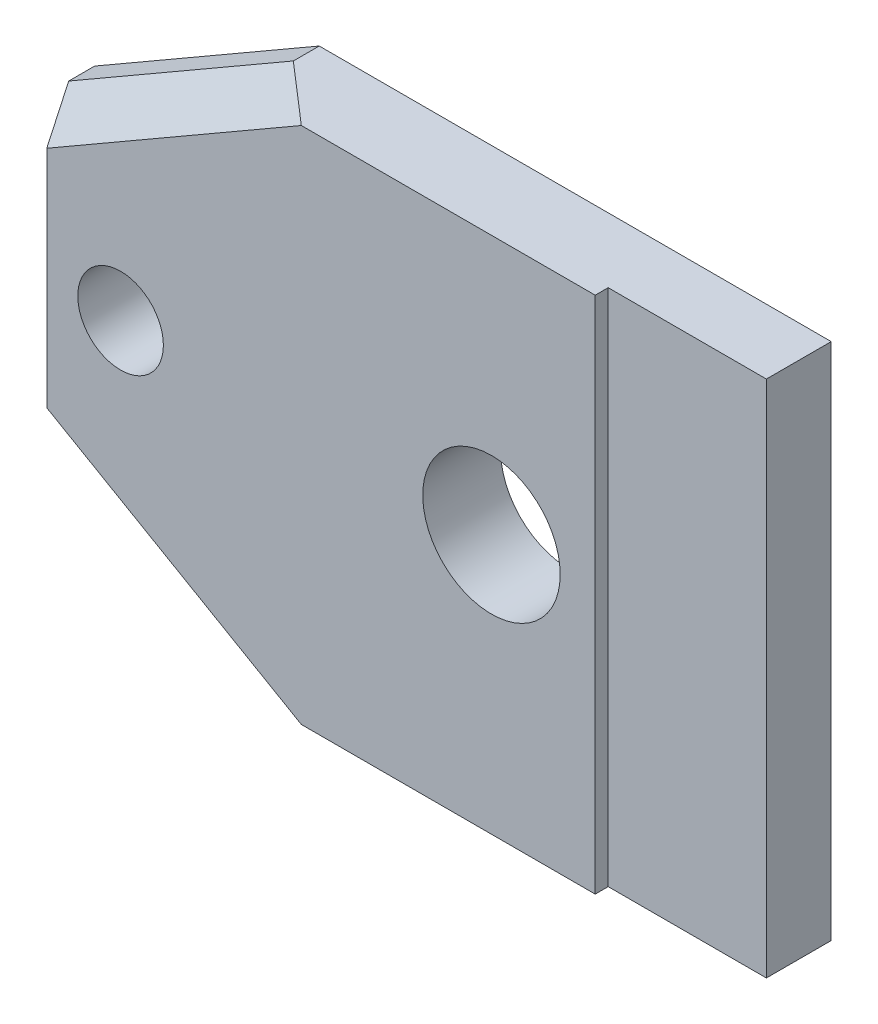
ISO-10303-21;
HEADER;
FILE_DESCRIPTION(('STEP AP214'),'2;1');
FILE_NAME('part.step','',(''),(''),'','','');
FILE_SCHEMA(('AUTOMOTIVE_DESIGN { 1 0 10303 214 1 1 1 1 }'));
ENDSEC;
DATA;
#1=APPLICATION_CONTEXT('core data for automotive mechanical design processes');
#2=APPLICATION_PROTOCOL_DEFINITION('international standard','automotive_design',2000,#1);
#3=PRODUCT_CONTEXT('',#1,'mechanical');
#4=PRODUCT('Part','Part','',(#3));
#5=PRODUCT_RELATED_PRODUCT_CATEGORY('part','',(#4));
#6=PRODUCT_DEFINITION_FORMATION('','',#4);
#7=PRODUCT_DEFINITION_CONTEXT('part definition',#1,'design');
#8=PRODUCT_DEFINITION('design','',#6,#7);
#9=PRODUCT_DEFINITION_SHAPE('','',#8);
#10=(LENGTH_UNIT() NAMED_UNIT(*) SI_UNIT(.MILLI.,.METRE.));
#11=(NAMED_UNIT(*) PLANE_ANGLE_UNIT() SI_UNIT($,.RADIAN.));
#12=(NAMED_UNIT(*) SI_UNIT($,.STERADIAN.) SOLID_ANGLE_UNIT());
#13=UNCERTAINTY_MEASURE_WITH_UNIT(LENGTH_MEASURE(1.E-05),#10,'distance_accuracy_value','');
#14=(GEOMETRIC_REPRESENTATION_CONTEXT(3) GLOBAL_UNCERTAINTY_ASSIGNED_CONTEXT((#13)) GLOBAL_UNIT_ASSIGNED_CONTEXT((#10,
#11,#12)) REPRESENTATION_CONTEXT('',''));
#15=CARTESIAN_POINT('',(0.,0.,0.));
#16=DIRECTION('',(0.,0.,1.));
#17=DIRECTION('',(1.,0.,0.));
#18=AXIS2_PLACEMENT_3D('',#15,#16,#17);
#19=CARTESIAN_POINT('',(0.,-8.50000000000195,11.4999999999869));
#20=DIRECTION('',(1.,0.,0.));
#21=DIRECTION('',(0.,-1.30506716544687E-12,1.));
#22=AXIS2_PLACEMENT_3D('',#19,#20,#21);
#23=PLANE('',#22);
#24=DIRECTION('',(0.,-1.30506716544687E-12,1.));
#25=VECTOR('',#24,1.);
#26=CARTESIAN_POINT('',(0.,-3.50000000000194,11.4999999999935));
#27=LINE('',#26,#25);
#28=CARTESIAN_POINT('',(0.,-3.49999999999803,8.49999999999347));
#29=VERTEX_POINT('',#28);
#30=CARTESIAN_POINT('',(0.,-3.49999999999933,9.49999999999345));
#31=VERTEX_POINT('',#30);
#32=EDGE_CURVE('E163',#29,#31,#27,.T.);
#33=ORIENTED_EDGE('',*,*,#32,.T.);
#34=DIRECTION('',(0.,1.,1.30506716544687E-12));
#35=VECTOR('',#34,1.);
#36=CARTESIAN_POINT('',(0.,-8.49999999999934,9.49999999998693));
#37=LINE('',#36,#35);
#38=CARTESIAN_POINT('',(0.,6.50000000000064,9.50000000000651));
#39=VERTEX_POINT('',#38);
#40=EDGE_CURVE('E11',#31,#39,#37,.T.);
#41=ORIENTED_EDGE('',*,*,#40,.T.);
#42=DIRECTION('',(0.,1.30506716544687E-12,-1.));
#43=VECTOR('',#42,1.);
#44=CARTESIAN_POINT('',(0.,6.49999999999803,11.5000000000065));
#45=LINE('',#44,#43);
#46=CARTESIAN_POINT('',(0.,6.50000000000195,8.50000000000652));
#47=VERTEX_POINT('',#46);
#48=EDGE_CURVE('E165',#39,#47,#45,.T.);
#49=ORIENTED_EDGE('',*,*,#48,.T.);
#50=DIRECTION('',(0.,1.,1.30506716544687E-12));
#51=VECTOR('',#50,1.);
#52=CARTESIAN_POINT('',(0.,-8.49999999999804,8.49999999998695));
#53=LINE('',#52,#51);
#54=EDGE_CURVE('E130',#29,#47,#53,.T.);
#55=ORIENTED_EDGE('',*,*,#54,.F.);
#56=EDGE_LOOP('',(#33,#41,#49,#55));
#57=FACE_BOUND('',#56,.T.);
#58=ADVANCED_FACE('F31',(#57),#23,.F.);
#59=CARTESIAN_POINT('',(0.,-8.49999999999804,8.49999999998695));
#60=DIRECTION('',(0.,-1.30506716544687E-12,1.));
#61=DIRECTION('',(0.,-1.,-1.30506716544687E-12));
#62=AXIS2_PLACEMENT_3D('',#59,#60,#61);
#63=PLANE('',#62);
#64=CARTESIAN_POINT('',(18.3,1.50000000000196,8.49999999999999));
#65=DIRECTION('',(0.,1.30506716544687E-12,-1.));
#66=DIRECTION('',(0.,1.,1.30506716544687E-12));
#67=AXIS2_PLACEMENT_3D('',#64,#65,#66);
#68=CIRCLE('',#67,2.65);
#69=CARTESIAN_POINT('',(18.3,4.15000000000196,8.50000000000346));
#70=VERTEX_POINT('',#69);
#71=EDGE_CURVE('E193',#70,#70,#68,.T.);
#72=ORIENTED_EDGE('',*,*,#71,.F.);
#73=EDGE_LOOP('',(#72));
#74=FACE_BOUND('',#73,.T.);
#75=CARTESIAN_POINT('',(4.,1.50000000000196,8.49999999999999));
#76=DIRECTION('',(0.,1.30506716544687E-12,-1.));
#77=DIRECTION('',(0.,1.,1.30506716544687E-12));
#78=AXIS2_PLACEMENT_3D('',#75,#76,#77);
#79=CIRCLE('',#78,1.65);
#80=CARTESIAN_POINT('',(4.,3.15000000000196,8.50000000000215));
#81=VERTEX_POINT('',#80);
#82=EDGE_CURVE('E203',#81,#81,#79,.T.);
#83=ORIENTED_EDGE('',*,*,#82,.F.);
#84=EDGE_LOOP('',(#83));
#85=FACE_BOUND('',#84,.T.);
#86=ORIENTED_EDGE('',*,*,#54,.T.);
#87=DIRECTION('',(-0.866025403784438,-0.500000000000001,-6.52533582723437E-13));
#88=VECTOR('',#87,1.);
#89=CARTESIAN_POINT('',(0.,6.50000000000195,8.50000000000652));
#90=LINE('',#89,#88);
#91=CARTESIAN_POINT('',(8.66025403784438,11.500000000002,8.50000000001305));
#92=VERTEX_POINT('',#91);
#93=EDGE_CURVE('E169',#47,#92,#90,.F.);
#94=ORIENTED_EDGE('',*,*,#93,.T.);
#95=DIRECTION('',(1.,0.,0.));
#96=VECTOR('',#95,1.);
#97=CARTESIAN_POINT('',(0.,11.500000000002,8.50000000001305));
#98=LINE('',#97,#96);
#99=CARTESIAN_POINT('',(28.4,11.500000000002,8.50000000001305));
#100=VERTEX_POINT('',#99);
#101=EDGE_CURVE('E127',#92,#100,#98,.T.);
#102=ORIENTED_EDGE('',*,*,#101,.T.);
#103=DIRECTION('',(0.,1.,1.30506716544687E-12));
#104=VECTOR('',#103,1.);
#105=CARTESIAN_POINT('',(28.4,-8.49999999999804,8.49999999998695));
#106=LINE('',#105,#104);
#107=CARTESIAN_POINT('',(28.4,-8.49999999999804,8.49999999998695));
#108=VERTEX_POINT('',#107);
#109=EDGE_CURVE('E123',#108,#100,#106,.T.);
#110=ORIENTED_EDGE('',*,*,#109,.F.);
#111=DIRECTION('',(1.,0.,0.));
#112=VECTOR('',#111,1.);
#113=CARTESIAN_POINT('',(0.,-8.49999999999804,8.49999999998695));
#114=LINE('',#113,#112);
#115=CARTESIAN_POINT('',(8.66025403784438,-8.49999999999804,8.49999999998695));
#116=VERTEX_POINT('',#115);
#117=EDGE_CURVE('E109',#116,#108,#114,.T.);
#118=ORIENTED_EDGE('',*,*,#117,.F.);
#119=DIRECTION('',(-0.866025403784438,0.500000000000001,6.52533582723437E-13));
#120=VECTOR('',#119,1.);
#121=CARTESIAN_POINT('',(8.66025403784438,-8.49999999999804,8.49999999998695));
#122=LINE('',#121,#120);
#123=EDGE_CURVE('E167',#116,#29,#122,.T.);
#124=ORIENTED_EDGE('',*,*,#123,.T.);
#125=EDGE_LOOP('',(#86,#94,#102,#110,#118,#124));
#126=FACE_BOUND('',#125,.T.);
#127=ADVANCED_FACE('F125',(#74,#85,#126),#63,.F.);
#128=CARTESIAN_POINT('',(28.4,-8.49999999999804,8.49999999998695));
#129=DIRECTION('',(-1.,0.,0.));
#130=DIRECTION('',(0.,-1.,-1.30506716544687E-12));
#131=AXIS2_PLACEMENT_3D('',#128,#129,#130);
#132=PLANE('',#131);
#133=DIRECTION('',(0.,-1.30506716544687E-12,1.));
#134=VECTOR('',#133,1.);
#135=CARTESIAN_POINT('',(28.4,11.500000000002,8.50000000001305));
#136=LINE('',#135,#134);
#137=CARTESIAN_POINT('',(28.4,11.4999999999987,11.000000000013));
#138=VERTEX_POINT('',#137);
#139=EDGE_CURVE('E147',#100,#138,#136,.T.);
#140=ORIENTED_EDGE('',*,*,#139,.T.);
#141=DIRECTION('',(0.,1.,1.30506716544687E-12));
#142=VECTOR('',#141,1.);
#143=CARTESIAN_POINT('',(28.4,-8.5000000000013,10.9999999999869));
#144=LINE('',#143,#142);
#145=CARTESIAN_POINT('',(28.4,-8.5000000000013,10.9999999999869));
#146=VERTEX_POINT('',#145);
#147=EDGE_CURVE('E131',#146,#138,#144,.T.);
#148=ORIENTED_EDGE('',*,*,#147,.F.);
#149=DIRECTION('',(0.,-1.30506716544687E-12,1.));
#150=VECTOR('',#149,1.);
#151=CARTESIAN_POINT('',(28.4,-8.49999999999804,8.49999999998695));
#152=LINE('',#151,#150);
#153=EDGE_CURVE('E114',#108,#146,#152,.T.);
#154=ORIENTED_EDGE('',*,*,#153,.F.);
#155=ORIENTED_EDGE('',*,*,#109,.T.);
#156=EDGE_LOOP('',(#140,#148,#154,#155));
#157=FACE_BOUND('',#156,.T.);
#158=ADVANCED_FACE('F133',(#157),#132,.F.);
#159=CARTESIAN_POINT('',(28.4,-8.5000000000013,10.9999999999869));
#160=DIRECTION('',(0.,1.30506716544687E-12,-1.));
#161=DIRECTION('',(1.,0.,0.));
#162=AXIS2_PLACEMENT_3D('',#159,#160,#161);
#163=PLANE('',#162);
#164=DIRECTION('',(-1.,0.,0.));
#165=VECTOR('',#164,1.);
#166=CARTESIAN_POINT('',(28.4,11.4999999999987,11.000000000013));
#167=LINE('',#166,#165);
#168=CARTESIAN_POINT('',(22.3,11.4999999999987,11.000000000013));
#169=VERTEX_POINT('',#168);
#170=EDGE_CURVE('E150',#138,#169,#167,.T.);
#171=ORIENTED_EDGE('',*,*,#170,.T.);
#172=DIRECTION('',(0.,1.,1.30506716544687E-12));
#173=VECTOR('',#172,1.);
#174=CARTESIAN_POINT('',(22.3,-8.5000000000013,10.9999999999869));
#175=LINE('',#174,#173);
#176=CARTESIAN_POINT('',(22.3,-8.5000000000013,10.9999999999869));
#177=VERTEX_POINT('',#176);
#178=EDGE_CURVE('E158',#177,#169,#175,.T.);
#179=ORIENTED_EDGE('',*,*,#178,.F.);
#180=DIRECTION('',(-1.,0.,0.));
#181=VECTOR('',#180,1.);
#182=CARTESIAN_POINT('',(28.4,-8.5000000000013,10.9999999999869));
#183=LINE('',#182,#181);
#184=EDGE_CURVE('E136',#146,#177,#183,.T.);
#185=ORIENTED_EDGE('',*,*,#184,.F.);
#186=ORIENTED_EDGE('',*,*,#147,.T.);
#187=EDGE_LOOP('',(#171,#179,#185,#186));
#188=FACE_BOUND('',#187,.T.);
#189=ADVANCED_FACE('F235',(#188),#163,.F.);
#190=CARTESIAN_POINT('',(22.3,-8.5000000000013,10.9999999999869));
#191=DIRECTION('',(-1.,0.,0.));
#192=DIRECTION('',(0.,-1.,-1.30506716544687E-12));
#193=AXIS2_PLACEMENT_3D('',#190,#191,#192);
#194=PLANE('',#193);
#195=DIRECTION('',(0.,-1.30506716544687E-12,1.));
#196=VECTOR('',#195,1.);
#197=CARTESIAN_POINT('',(22.3,11.4999999999987,11.000000000013));
#198=LINE('',#197,#196);
#199=CARTESIAN_POINT('',(22.3,11.499999999998,11.500000000013));
#200=VERTEX_POINT('',#199);
#201=EDGE_CURVE('E152',#169,#200,#198,.T.);
#202=ORIENTED_EDGE('',*,*,#201,.T.);
#203=DIRECTION('',(0.,1.,1.30506716544687E-12));
#204=VECTOR('',#203,1.);
#205=CARTESIAN_POINT('',(22.3,-8.50000000000195,11.4999999999869));
#206=LINE('',#205,#204);
#207=CARTESIAN_POINT('',(22.3,-8.50000000000195,11.4999999999869));
#208=VERTEX_POINT('',#207);
#209=EDGE_CURVE('E145',#208,#200,#206,.T.);
#210=ORIENTED_EDGE('',*,*,#209,.F.);
#211=DIRECTION('',(0.,-1.30506716544687E-12,1.));
#212=VECTOR('',#211,1.);
#213=CARTESIAN_POINT('',(22.3,-8.5000000000013,10.9999999999869));
#214=LINE('',#213,#212);
#215=EDGE_CURVE('E138',#177,#208,#214,.T.);
#216=ORIENTED_EDGE('',*,*,#215,.F.);
#217=ORIENTED_EDGE('',*,*,#178,.T.);
#218=EDGE_LOOP('',(#202,#210,#216,#217));
#219=FACE_BOUND('',#218,.T.);
#220=ADVANCED_FACE('F216',(#219),#194,.F.);
#221=CARTESIAN_POINT('',(22.3,-8.50000000000195,11.4999999999869));
#222=DIRECTION('',(0.,1.30506716544687E-12,-1.));
#223=DIRECTION('',(1.,0.,0.));
#224=AXIS2_PLACEMENT_3D('',#221,#222,#223);
#225=PLANE('',#224);
#226=CARTESIAN_POINT('',(18.3,1.49999999999804,11.5));
#227=DIRECTION('',(0.,1.30506716544687E-12,-1.));
#228=DIRECTION('',(1.,0.,0.));
#229=AXIS2_PLACEMENT_3D('',#226,#227,#228);
#230=CIRCLE('',#229,2.65);
#231=CARTESIAN_POINT('',(20.95,1.49999999999804,11.5));
#232=VERTEX_POINT('',#231);
#233=EDGE_CURVE('E198',#232,#232,#230,.F.);
#234=ORIENTED_EDGE('',*,*,#233,.F.);
#235=EDGE_LOOP('',(#234));
#236=FACE_BOUND('',#235,.T.);
#237=CARTESIAN_POINT('',(4.,1.49999999999805,11.5));
#238=DIRECTION('',(0.,1.30506716544687E-12,-1.));
#239=DIRECTION('',(1.,0.,0.));
#240=AXIS2_PLACEMENT_3D('',#237,#238,#239);
#241=CIRCLE('',#240,1.65);
#242=CARTESIAN_POINT('',(5.65,1.49999999999805,11.5));
#243=VERTEX_POINT('',#242);
#244=EDGE_CURVE('E148',#243,#243,#241,.F.);
#245=ORIENTED_EDGE('',*,*,#244,.F.);
#246=EDGE_LOOP('',(#245));
#247=FACE_BOUND('',#246,.T.);
#248=DIRECTION('',(0.,-1.,-1.30506716544687E-12));
#249=VECTOR('',#248,1.);
#250=CARTESIAN_POINT('',(1.15470053837925,-8.50000000000195,11.4999999999869));
#251=LINE('',#250,#249);
#252=CARTESIAN_POINT('',(1.15470053837925,5.83333333333137,11.5000000000057));
#253=VERTEX_POINT('',#252);
#254=CARTESIAN_POINT('',(1.15470053837925,-2.83333333333528,11.4999999999943));
#255=VERTEX_POINT('',#254);
#256=EDGE_CURVE('E174',#253,#255,#251,.T.);
#257=ORIENTED_EDGE('',*,*,#256,.T.);
#258=DIRECTION('',(0.866025403784438,-0.500000000000001,-6.52432530171953E-13));
#259=VECTOR('',#258,1.);
#260=CARTESIAN_POINT('',(9.23760430703402,-7.50000000000196,11.4999999999883));
#261=LINE('',#260,#259);
#262=CARTESIAN_POINT('',(10.9696551146029,-8.50000000000195,11.4999999999869));
#263=VERTEX_POINT('',#262);
#264=EDGE_CURVE('E178',#255,#263,#261,.T.);
#265=ORIENTED_EDGE('',*,*,#264,.T.);
#266=DIRECTION('',(-1.,0.,0.));
#267=VECTOR('',#266,1.);
#268=CARTESIAN_POINT('',(22.3,-8.50000000000195,11.4999999999869));
#269=LINE('',#268,#267);
#270=EDGE_CURVE('E143',#208,#263,#269,.T.);
#271=ORIENTED_EDGE('',*,*,#270,.F.);
#272=ORIENTED_EDGE('',*,*,#209,.T.);
#273=DIRECTION('',(-1.,0.,0.));
#274=VECTOR('',#273,1.);
#275=CARTESIAN_POINT('',(22.3,11.499999999998,11.500000000013));
#276=LINE('',#275,#274);
#277=CARTESIAN_POINT('',(10.9696551146029,11.499999999998,11.500000000013));
#278=VERTEX_POINT('',#277);
#279=EDGE_CURVE('E120',#200,#278,#276,.T.);
#280=ORIENTED_EDGE('',*,*,#279,.T.);
#281=DIRECTION('',(-0.866025403784438,-0.500000000000001,-6.52634635274922E-13));
#282=VECTOR('',#281,1.);
#283=CARTESIAN_POINT('',(0.577350269189626,5.49999999999804,11.5000000000052));
#284=LINE('',#283,#282);
#285=EDGE_CURVE('E176',#278,#253,#284,.T.);
#286=ORIENTED_EDGE('',*,*,#285,.T.);
#287=EDGE_LOOP('',(#257,#265,#271,#272,#280,#286));
#288=FACE_BOUND('',#287,.T.);
#289=ADVANCED_FACE('F213',(#236,#247,#288),#225,.F.);
#290=CARTESIAN_POINT('',(0.,-8.49999999999804,8.49999999998695));
#291=DIRECTION('',(0.,-1.,-1.30506716544687E-12));
#292=DIRECTION('',(1.,0.,0.));
#293=AXIS2_PLACEMENT_3D('',#290,#291,#292);
#294=PLANE('',#293);
#295=ORIENTED_EDGE('',*,*,#270,.T.);
#296=DIRECTION('',(-0.755928946018452,8.54367010380254E-13,-0.654653670707981));
#297=VECTOR('',#296,1.);
#298=CARTESIAN_POINT('',(3.2166657854851,-8.49999999999319,4.78571428570121));
#299=LINE('',#298,#297);
#300=CARTESIAN_POINT('',(8.66025403784438,-8.49999999999934,9.49999999998693));
#301=VERTEX_POINT('',#300);
#302=EDGE_CURVE('E181',#263,#301,#299,.T.);
#303=ORIENTED_EDGE('',*,*,#302,.T.);
#304=DIRECTION('',(0.,1.30506716544687E-12,-1.));
#305=VECTOR('',#304,1.);
#306=CARTESIAN_POINT('',(8.66025403784438,-8.49999999999804,8.49999999998694));
#307=LINE('',#306,#305);
#308=EDGE_CURVE('E117',#301,#116,#307,.T.);
#309=ORIENTED_EDGE('',*,*,#308,.T.);
#310=ORIENTED_EDGE('',*,*,#117,.T.);
#311=ORIENTED_EDGE('',*,*,#153,.T.);
#312=ORIENTED_EDGE('',*,*,#184,.T.);
#313=ORIENTED_EDGE('',*,*,#215,.T.);
#314=EDGE_LOOP('',(#295,#303,#309,#310,#311,#312,#313));
#315=FACE_BOUND('',#314,.T.);
#316=ADVANCED_FACE('F112',(#315),#294,.T.);
#317=CARTESIAN_POINT('',(0.,11.500000000002,8.50000000001305));
#318=DIRECTION('',(0.,-1.,-1.30506716544687E-12));
#319=DIRECTION('',(1.,0.,0.));
#320=AXIS2_PLACEMENT_3D('',#317,#318,#319);
#321=PLANE('',#320);
#322=DIRECTION('',(0.,-1.30506716544687E-12,1.));
#323=VECTOR('',#322,1.);
#324=CARTESIAN_POINT('',(8.66025403784438,11.500000000002,8.50000000001304));
#325=LINE('',#324,#323);
#326=CARTESIAN_POINT('',(8.66025403784438,11.5000000000007,9.50000000001303));
#327=VERTEX_POINT('',#326);
#328=EDGE_CURVE('E171',#92,#327,#325,.T.);
#329=ORIENTED_EDGE('',*,*,#328,.T.);
#330=DIRECTION('',(-0.755928946018451,8.54367010380255E-13,-0.654653670707981));
#331=VECTOR('',#330,1.);
#332=CARTESIAN_POINT('',(10.8768006152906,11.4999999999982,11.4195856447529));
#333=LINE('',#332,#331);
#334=EDGE_CURVE('E40',#327,#278,#333,.F.);
#335=ORIENTED_EDGE('',*,*,#334,.T.);
#336=ORIENTED_EDGE('',*,*,#279,.F.);
#337=ORIENTED_EDGE('',*,*,#201,.F.);
#338=ORIENTED_EDGE('',*,*,#170,.F.);
#339=ORIENTED_EDGE('',*,*,#139,.F.);
#340=ORIENTED_EDGE('',*,*,#101,.F.);
#341=EDGE_LOOP('',(#329,#335,#336,#337,#338,#339,#340));
#342=FACE_BOUND('',#341,.T.);
#343=ADVANCED_FACE('F230',(#342),#321,.F.);
#344=CARTESIAN_POINT('',(4.,1.49999999998826,18.9953318805774));
#345=DIRECTION('',(0.,1.30506716544687E-12,-1.));
#346=DIRECTION('',(0.,1.,1.30506716544687E-12));
#347=AXIS2_PLACEMENT_3D('',#344,#345,#346);
#348=CYLINDRICAL_SURFACE('',#347,1.65);
#349=ORIENTED_EDGE('',*,*,#244,.T.);
#350=EDGE_LOOP('',(#349));
#351=FACE_BOUND('',#350,.T.);
#352=ORIENTED_EDGE('',*,*,#82,.T.);
#353=EDGE_LOOP('',(#352));
#354=FACE_BOUND('',#353,.T.);
#355=ADVANCED_FACE('F210',(#351,#354),#348,.F.);
#356=CARTESIAN_POINT('',(18.3,1.49999999998826,18.9953318805774));
#357=DIRECTION('',(0.,1.30506716544687E-12,-1.));
#358=DIRECTION('',(0.,1.,1.30506716544687E-12));
#359=AXIS2_PLACEMENT_3D('',#356,#357,#358);
#360=CYLINDRICAL_SURFACE('',#359,2.65);
#361=ORIENTED_EDGE('',*,*,#233,.T.);
#362=EDGE_LOOP('',(#361));
#363=FACE_BOUND('',#362,.T.);
#364=ORIENTED_EDGE('',*,*,#71,.T.);
#365=EDGE_LOOP('',(#364));
#366=FACE_BOUND('',#365,.T.);
#367=ADVANCED_FACE('F258',(#363,#366),#360,.F.);
#368=CARTESIAN_POINT('',(0.,6.49999999999803,11.5000000000065));
#369=DIRECTION('',(0.500000000000001,-0.866025403784438,-1.1303217389338E-12));
#370=DIRECTION('',(0.866025403784438,0.500000000000001,6.52533582723437E-13));
#371=AXIS2_PLACEMENT_3D('',#368,#369,#370);
#372=PLANE('',#371);
#373=ORIENTED_EDGE('',*,*,#48,.F.);
#374=DIRECTION('',(-0.866025403784438,-0.500000000000001,-6.52634635274922E-13));
#375=VECTOR('',#374,1.);
#376=CARTESIAN_POINT('',(8.66025403784441,11.5000000000007,9.50000000001303));
#377=LINE('',#376,#375);
#378=EDGE_CURVE('E53',#39,#327,#377,.F.);
#379=ORIENTED_EDGE('',*,*,#378,.T.);
#380=ORIENTED_EDGE('',*,*,#328,.F.);
#381=ORIENTED_EDGE('',*,*,#93,.F.);
#382=EDGE_LOOP('',(#373,#379,#380,#381));
#383=FACE_BOUND('',#382,.T.);
#384=ADVANCED_FACE('F228',(#383),#372,.F.);
#385=CARTESIAN_POINT('',(8.66025403784438,-8.49999999999804,8.49999999998694));
#386=DIRECTION('',(-0.500000000000001,-0.866025403784438,-1.13012089891008E-12));
#387=DIRECTION('',(0.866025403784438,-0.500000000000001,-6.52533582723437E-13));
#388=AXIS2_PLACEMENT_3D('',#385,#386,#387);
#389=PLANE('',#388);
#390=ORIENTED_EDGE('',*,*,#308,.F.);
#391=DIRECTION('',(-0.866025403784438,0.500000000000001,6.52432530171953E-13));
#392=VECTOR('',#391,1.);
#393=CARTESIAN_POINT('',(0.,-3.49999999999933,9.49999999999345));
#394=LINE('',#393,#392);
#395=EDGE_CURVE('E183',#301,#31,#394,.T.);
#396=ORIENTED_EDGE('',*,*,#395,.T.);
#397=ORIENTED_EDGE('',*,*,#32,.F.);
#398=ORIENTED_EDGE('',*,*,#123,.F.);
#399=EDGE_LOOP('',(#390,#396,#397,#398));
#400=FACE_BOUND('',#399,.T.);
#401=ADVANCED_FACE('F224',(#400),#389,.T.);
#402=CARTESIAN_POINT('',(10.8071597408063,11.4061832521945,11.5000000000129));
#403=DIRECTION('',(0.433012701892221,-0.749999999999349,-0.500000000000975));
#404=DIRECTION('',(0.,0.554700196226312,-0.832050294337122));
#405=AXIS2_PLACEMENT_3D('',#402,#403,#404);
#406=PLANE('',#405);
#407=ORIENTED_EDGE('',*,*,#334,.F.);
#408=ORIENTED_EDGE('',*,*,#378,.F.);
#409=DIRECTION('',(-0.480384461415259,0.277350098113698,-0.832050294337484));
#410=VECTOR('',#409,1.);
#411=CARTESIAN_POINT('',(1.99852016257944,5.34615384615,12.9615384615434));
#412=LINE('',#411,#410);
#413=EDGE_CURVE('E35',#253,#39,#412,.T.);
#414=ORIENTED_EDGE('',*,*,#413,.F.);
#415=ORIENTED_EDGE('',*,*,#285,.F.);
#416=EDGE_LOOP('',(#407,#408,#414,#415));
#417=FACE_BOUND('',#416,.T.);
#418=ADVANCED_FACE('F33',(#417),#406,.F.);
#419=CARTESIAN_POINT('',(0.,-8.49999999999934,9.49999999998693));
#420=DIRECTION('',(0.86602540378444,6.52533582723432E-13,-0.499999999999997));
#421=DIRECTION('',(0.499999999999997,-1.13022131892194E-12,0.86602540378444));
#422=AXIS2_PLACEMENT_3D('',#419,#420,#421);
#423=PLANE('',#422);
#424=ORIENTED_EDGE('',*,*,#413,.T.);
#425=ORIENTED_EDGE('',*,*,#40,.F.);
#426=DIRECTION('',(-0.480384461415259,-0.277350098111527,-0.832050294338208));
#427=VECTOR('',#426,1.);
#428=CARTESIAN_POINT('',(-0.666173387526485,-3.88461538461321,8.3461538461468));
#429=LINE('',#428,#427);
#430=EDGE_CURVE('E186',#255,#31,#429,.T.);
#431=ORIENTED_EDGE('',*,*,#430,.F.);
#432=ORIENTED_EDGE('',*,*,#256,.F.);
#433=EDGE_LOOP('',(#424,#425,#431,#432));
#434=FACE_BOUND('',#433,.T.);
#435=ADVANCED_FACE('F221',(#434),#423,.F.);
#436=CARTESIAN_POINT('',(19.4674137786507,-13.4061832521985,11.4999999999805));
#437=DIRECTION('',(-0.433012701892221,-0.750000000000653,0.499999999999019));
#438=DIRECTION('',(0.,-0.554700196224141,-0.832050294338569));
#439=AXIS2_PLACEMENT_3D('',#436,#437,#438);
#440=PLANE('',#439);
#441=ORIENTED_EDGE('',*,*,#430,.T.);
#442=ORIENTED_EDGE('',*,*,#395,.F.);
#443=ORIENTED_EDGE('',*,*,#302,.F.);
#444=ORIENTED_EDGE('',*,*,#264,.F.);
#445=EDGE_LOOP('',(#441,#442,#443,#444));
#446=FACE_BOUND('',#445,.T.);
#447=ADVANCED_FACE('F222',(#446),#440,.T.);
#448=CLOSED_SHELL('',(#58,#127,#158,#189,#220,#289,#316,#343,#355,#367,#384,#401,#418,#435,#447));
#449=MANIFOLD_SOLID_BREP('B2',#448);
#450=ADVANCED_BREP_SHAPE_REPRESENTATION('',(#18,#449),#14);
#451=SHAPE_DEFINITION_REPRESENTATION(#9,#450);
ENDSEC;
END-ISO-10303-21;
